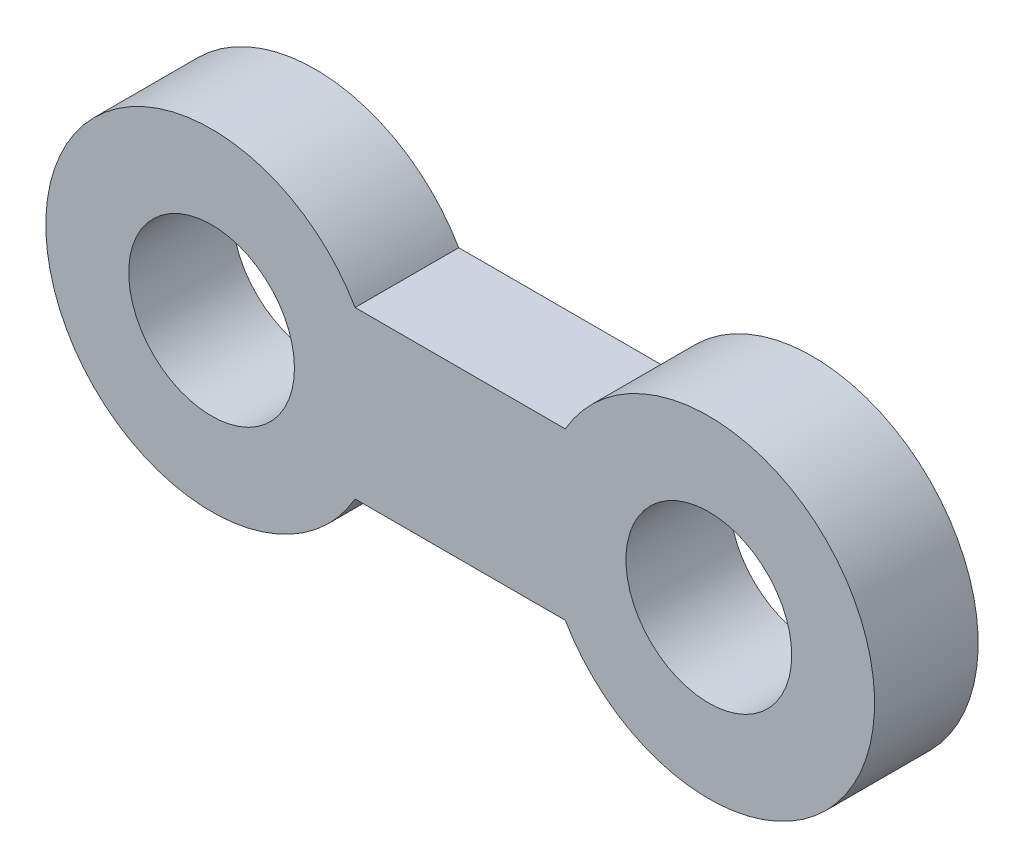
ISO-10303-21;
HEADER;
FILE_DESCRIPTION(('STEP AP214'),'2;1');
FILE_NAME('part.step','',(''),(''),'','','');
FILE_SCHEMA(('AUTOMOTIVE_DESIGN { 1 0 10303 214 1 1 1 1 }'));
ENDSEC;
DATA;
#1=APPLICATION_CONTEXT('core data for automotive mechanical design processes');
#2=APPLICATION_PROTOCOL_DEFINITION('international standard','automotive_design',2000,#1);
#3=PRODUCT_CONTEXT('',#1,'mechanical');
#4=PRODUCT('Part','Part','',(#3));
#5=PRODUCT_RELATED_PRODUCT_CATEGORY('part','',(#4));
#6=PRODUCT_DEFINITION_FORMATION('','',#4);
#7=PRODUCT_DEFINITION_CONTEXT('part definition',#1,'design');
#8=PRODUCT_DEFINITION('design','',#6,#7);
#9=PRODUCT_DEFINITION_SHAPE('','',#8);
#10=(LENGTH_UNIT() NAMED_UNIT(*) SI_UNIT(.MILLI.,.METRE.));
#11=(NAMED_UNIT(*) PLANE_ANGLE_UNIT() SI_UNIT($,.RADIAN.));
#12=(NAMED_UNIT(*) SI_UNIT($,.STERADIAN.) SOLID_ANGLE_UNIT());
#13=UNCERTAINTY_MEASURE_WITH_UNIT(LENGTH_MEASURE(1.E-05),#10,'distance_accuracy_value','');
#14=(GEOMETRIC_REPRESENTATION_CONTEXT(3) GLOBAL_UNCERTAINTY_ASSIGNED_CONTEXT((#13)) GLOBAL_UNIT_ASSIGNED_CONTEXT((#10,
#11,#12)) REPRESENTATION_CONTEXT('',''));
#15=CARTESIAN_POINT('',(0.,0.,0.));
#16=DIRECTION('',(0.,0.,1.));
#17=DIRECTION('',(1.,0.,0.));
#18=AXIS2_PLACEMENT_3D('',#15,#16,#17);
#19=CARTESIAN_POINT('',(0.,0.,3.175));
#20=DIRECTION('',(0.,1.,0.));
#21=DIRECTION('',(0.,0.,1.));
#22=AXIS2_PLACEMENT_3D('',#19,#20,#21);
#23=PLANE('',#22);
#24=DIRECTION('',(1.,0.,0.));
#25=VECTOR('',#24,1.);
#26=CARTESIAN_POINT('',(0.,0.,0.));
#27=LINE('',#26,#25);
#28=CARTESIAN_POINT('',(4.39940905122495,0.,0.));
#29=VERTEX_POINT('',#28);
#30=CARTESIAN_POINT('',(10.840590948775,0.,0.));
#31=VERTEX_POINT('',#30);
#32=EDGE_CURVE('E112',#29,#31,#27,.T.);
#33=ORIENTED_EDGE('',*,*,#32,.T.);
#34=DIRECTION('',(0.,0.,-1.));
#35=VECTOR('',#34,1.);
#36=CARTESIAN_POINT('',(10.840590948775,0.,3.175));
#37=LINE('',#36,#35);
#38=CARTESIAN_POINT('',(10.840590948775,0.,3.175));
#39=VERTEX_POINT('',#38);
#40=EDGE_CURVE('E75',#39,#31,#37,.T.);
#41=ORIENTED_EDGE('',*,*,#40,.F.);
#42=DIRECTION('',(1.,0.,0.));
#43=VECTOR('',#42,1.);
#44=CARTESIAN_POINT('',(0.,0.,3.175));
#45=LINE('',#44,#43);
#46=CARTESIAN_POINT('',(4.39940905122495,0.,3.175));
#47=VERTEX_POINT('',#46);
#48=EDGE_CURVE('E109',#47,#39,#45,.T.);
#49=ORIENTED_EDGE('',*,*,#48,.F.);
#50=DIRECTION('',(0.,0.,-1.));
#51=VECTOR('',#50,1.);
#52=CARTESIAN_POINT('',(4.39940905122495,0.,3.175));
#53=LINE('',#52,#51);
#54=EDGE_CURVE('E12',#47,#29,#53,.T.);
#55=ORIENTED_EDGE('',*,*,#54,.T.);
#56=EDGE_LOOP('',(#33,#41,#49,#55));
#57=FACE_BOUND('',#56,.T.);
#58=ADVANCED_FACE('F65',(#57),#23,.F.);
#59=CARTESIAN_POINT('',(0.,5.08,3.175));
#60=DIRECTION('',(0.,1.,0.));
#61=DIRECTION('',(0.,0.,1.));
#62=AXIS2_PLACEMENT_3D('',#59,#60,#61);
#63=PLANE('',#62);
#64=DIRECTION('',(1.,0.,0.));
#65=VECTOR('',#64,1.);
#66=CARTESIAN_POINT('',(0.,5.08,0.));
#67=LINE('',#66,#65);
#68=CARTESIAN_POINT('',(4.39940905122495,5.08,0.));
#69=VERTEX_POINT('',#68);
#70=CARTESIAN_POINT('',(10.840590948775,5.08,0.));
#71=VERTEX_POINT('',#70);
#72=EDGE_CURVE('E142',#69,#71,#67,.T.);
#73=ORIENTED_EDGE('',*,*,#72,.F.);
#74=DIRECTION('',(0.,0.,-1.));
#75=VECTOR('',#74,1.);
#76=CARTESIAN_POINT('',(4.39940905122495,5.08,3.175));
#77=LINE('',#76,#75);
#78=CARTESIAN_POINT('',(4.39940905122495,5.08,3.175));
#79=VERTEX_POINT('',#78);
#80=EDGE_CURVE('E83',#79,#69,#77,.T.);
#81=ORIENTED_EDGE('',*,*,#80,.F.);
#82=DIRECTION('',(1.,0.,0.));
#83=VECTOR('',#82,1.);
#84=CARTESIAN_POINT('',(0.,5.08,3.175));
#85=LINE('',#84,#83);
#86=CARTESIAN_POINT('',(10.840590948775,5.08,3.175));
#87=VERTEX_POINT('',#86);
#88=EDGE_CURVE('E127',#79,#87,#85,.T.);
#89=ORIENTED_EDGE('',*,*,#88,.T.);
#90=DIRECTION('',(0.,0.,-1.));
#91=VECTOR('',#90,1.);
#92=CARTESIAN_POINT('',(10.840590948775,5.08,3.175));
#93=LINE('',#92,#91);
#94=EDGE_CURVE('E96',#87,#71,#93,.T.);
#95=ORIENTED_EDGE('',*,*,#94,.T.);
#96=EDGE_LOOP('',(#73,#81,#89,#95));
#97=FACE_BOUND('',#96,.T.);
#98=ADVANCED_FACE('F186',(#97),#63,.T.);
#99=CARTESIAN_POINT('',(15.24,2.54,3.175));
#100=DIRECTION('',(0.,0.,-1.));
#101=DIRECTION('',(-1.,0.,0.));
#102=AXIS2_PLACEMENT_3D('',#99,#100,#101);
#103=CYLINDRICAL_SURFACE('',#102,5.08);
#104=CARTESIAN_POINT('',(15.24,2.54,0.));
#105=DIRECTION('',(0.,0.,1.));
#106=DIRECTION('',(1.,0.,0.));
#107=AXIS2_PLACEMENT_3D('',#104,#105,#106);
#108=CIRCLE('',#107,5.08);
#109=EDGE_CURVE('E139',#31,#71,#108,.T.);
#110=ORIENTED_EDGE('',*,*,#109,.T.);
#111=ORIENTED_EDGE('',*,*,#94,.F.);
#112=CARTESIAN_POINT('',(15.24,2.54,3.175));
#113=DIRECTION('',(0.,0.,1.));
#114=DIRECTION('',(1.,0.,0.));
#115=AXIS2_PLACEMENT_3D('',#112,#113,#114);
#116=CIRCLE('',#115,5.08);
#117=EDGE_CURVE('E121',#39,#87,#116,.T.);
#118=ORIENTED_EDGE('',*,*,#117,.F.);
#119=ORIENTED_EDGE('',*,*,#40,.T.);
#120=EDGE_LOOP('',(#110,#111,#118,#119));
#121=FACE_BOUND('',#120,.T.);
#122=ADVANCED_FACE('F125',(#121),#103,.T.);
#123=CARTESIAN_POINT('',(0.,0.,0.));
#124=DIRECTION('',(0.,0.,1.));
#125=DIRECTION('',(1.,0.,0.));
#126=AXIS2_PLACEMENT_3D('',#123,#124,#125);
#127=PLANE('',#126);
#128=CARTESIAN_POINT('',(0.,2.54,0.));
#129=DIRECTION('',(0.,0.,1.));
#130=DIRECTION('',(1.,0.,0.));
#131=AXIS2_PLACEMENT_3D('',#128,#129,#130);
#132=CIRCLE('',#131,2.54);
#133=CARTESIAN_POINT('',(2.54000000000002,2.54,0.));
#134=VERTEX_POINT('',#133);
#135=EDGE_CURVE('E136',#134,#134,#132,.T.);
#136=ORIENTED_EDGE('',*,*,#135,.T.);
#137=EDGE_LOOP('',(#136));
#138=FACE_BOUND('',#137,.T.);
#139=CARTESIAN_POINT('',(15.24,2.54,0.));
#140=DIRECTION('',(0.,0.,1.));
#141=DIRECTION('',(1.,0.,0.));
#142=AXIS2_PLACEMENT_3D('',#139,#140,#141);
#143=CIRCLE('',#142,2.54);
#144=CARTESIAN_POINT('',(17.78,2.54,0.));
#145=VERTEX_POINT('',#144);
#146=EDGE_CURVE('E156',#145,#145,#143,.T.);
#147=ORIENTED_EDGE('',*,*,#146,.T.);
#148=EDGE_LOOP('',(#147));
#149=FACE_BOUND('',#148,.T.);
#150=ORIENTED_EDGE('',*,*,#109,.F.);
#151=ORIENTED_EDGE('',*,*,#32,.F.);
#152=CARTESIAN_POINT('',(0.,2.54,0.));
#153=DIRECTION('',(0.,0.,1.));
#154=DIRECTION('',(1.,0.,0.));
#155=AXIS2_PLACEMENT_3D('',#152,#153,#154);
#156=CIRCLE('',#155,5.08);
#157=EDGE_CURVE('E133',#69,#29,#156,.T.);
#158=ORIENTED_EDGE('',*,*,#157,.F.);
#159=ORIENTED_EDGE('',*,*,#72,.T.);
#160=EDGE_LOOP('',(#150,#151,#158,#159));
#161=FACE_BOUND('',#160,.T.);
#162=ADVANCED_FACE('F168',(#138,#149,#161),#127,.F.);
#163=CARTESIAN_POINT('',(0.,0.,3.175));
#164=DIRECTION('',(0.,0.,1.));
#165=DIRECTION('',(1.,0.,0.));
#166=AXIS2_PLACEMENT_3D('',#163,#164,#165);
#167=PLANE('',#166);
#168=CARTESIAN_POINT('',(0.,2.54,3.175));
#169=DIRECTION('',(0.,0.,1.));
#170=DIRECTION('',(1.,0.,0.));
#171=AXIS2_PLACEMENT_3D('',#168,#169,#170);
#172=CIRCLE('',#171,2.54);
#173=CARTESIAN_POINT('',(2.54000000000002,2.54,3.175));
#174=VERTEX_POINT('',#173);
#175=EDGE_CURVE('E160',#174,#174,#172,.T.);
#176=ORIENTED_EDGE('',*,*,#175,.F.);
#177=EDGE_LOOP('',(#176));
#178=FACE_BOUND('',#177,.T.);
#179=CARTESIAN_POINT('',(15.24,2.54,3.175));
#180=DIRECTION('',(0.,0.,1.));
#181=DIRECTION('',(1.,0.,0.));
#182=AXIS2_PLACEMENT_3D('',#179,#180,#181);
#183=CIRCLE('',#182,2.54);
#184=CARTESIAN_POINT('',(17.78,2.54,3.175));
#185=VERTEX_POINT('',#184);
#186=EDGE_CURVE('E152',#185,#185,#183,.T.);
#187=ORIENTED_EDGE('',*,*,#186,.F.);
#188=EDGE_LOOP('',(#187));
#189=FACE_BOUND('',#188,.T.);
#190=ORIENTED_EDGE('',*,*,#48,.T.);
#191=ORIENTED_EDGE('',*,*,#117,.T.);
#192=ORIENTED_EDGE('',*,*,#88,.F.);
#193=CARTESIAN_POINT('',(0.,2.54,3.175));
#194=DIRECTION('',(0.,0.,1.));
#195=DIRECTION('',(1.,0.,0.));
#196=AXIS2_PLACEMENT_3D('',#193,#194,#195);
#197=CIRCLE('',#196,5.08);
#198=EDGE_CURVE('E122',#79,#47,#197,.T.);
#199=ORIENTED_EDGE('',*,*,#198,.T.);
#200=EDGE_LOOP('',(#190,#191,#192,#199));
#201=FACE_BOUND('',#200,.T.);
#202=ADVANCED_FACE('F119',(#178,#189,#201),#167,.T.);
#203=CARTESIAN_POINT('',(0.,2.54,3.175));
#204=DIRECTION('',(0.,0.,-1.));
#205=DIRECTION('',(-1.,0.,0.));
#206=AXIS2_PLACEMENT_3D('',#203,#204,#205);
#207=CYLINDRICAL_SURFACE('',#206,5.08);
#208=ORIENTED_EDGE('',*,*,#157,.T.);
#209=ORIENTED_EDGE('',*,*,#54,.F.);
#210=ORIENTED_EDGE('',*,*,#198,.F.);
#211=ORIENTED_EDGE('',*,*,#80,.T.);
#212=EDGE_LOOP('',(#208,#209,#210,#211));
#213=FACE_BOUND('',#212,.T.);
#214=ADVANCED_FACE('F67',(#213),#207,.T.);
#215=CARTESIAN_POINT('',(15.24,2.54,0.));
#216=DIRECTION('',(0.,0.,1.));
#217=DIRECTION('',(1.,0.,0.));
#218=AXIS2_PLACEMENT_3D('',#215,#216,#217);
#219=CYLINDRICAL_SURFACE('',#218,2.54);
#220=ORIENTED_EDGE('',*,*,#146,.F.);
#221=EDGE_LOOP('',(#220));
#222=FACE_BOUND('',#221,.T.);
#223=ORIENTED_EDGE('',*,*,#186,.T.);
#224=EDGE_LOOP('',(#223));
#225=FACE_BOUND('',#224,.T.);
#226=ADVANCED_FACE('F174',(#222,#225),#219,.F.);
#227=CARTESIAN_POINT('',(0.,2.54,0.));
#228=DIRECTION('',(0.,0.,1.));
#229=DIRECTION('',(1.,0.,0.));
#230=AXIS2_PLACEMENT_3D('',#227,#228,#229);
#231=CYLINDRICAL_SURFACE('',#230,2.54);
#232=ORIENTED_EDGE('',*,*,#135,.F.);
#233=EDGE_LOOP('',(#232));
#234=FACE_BOUND('',#233,.T.);
#235=ORIENTED_EDGE('',*,*,#175,.T.);
#236=EDGE_LOOP('',(#235));
#237=FACE_BOUND('',#236,.T.);
#238=ADVANCED_FACE('F171',(#234,#237),#231,.F.);
#239=CLOSED_SHELL('',(#58,#98,#122,#162,#202,#214,#226,#238));
#240=MANIFOLD_SOLID_BREP('B2',#239);
#241=ADVANCED_BREP_SHAPE_REPRESENTATION('',(#18,#240),#14);
#242=SHAPE_DEFINITION_REPRESENTATION(#9,#241);
ENDSEC;
END-ISO-10303-21;
